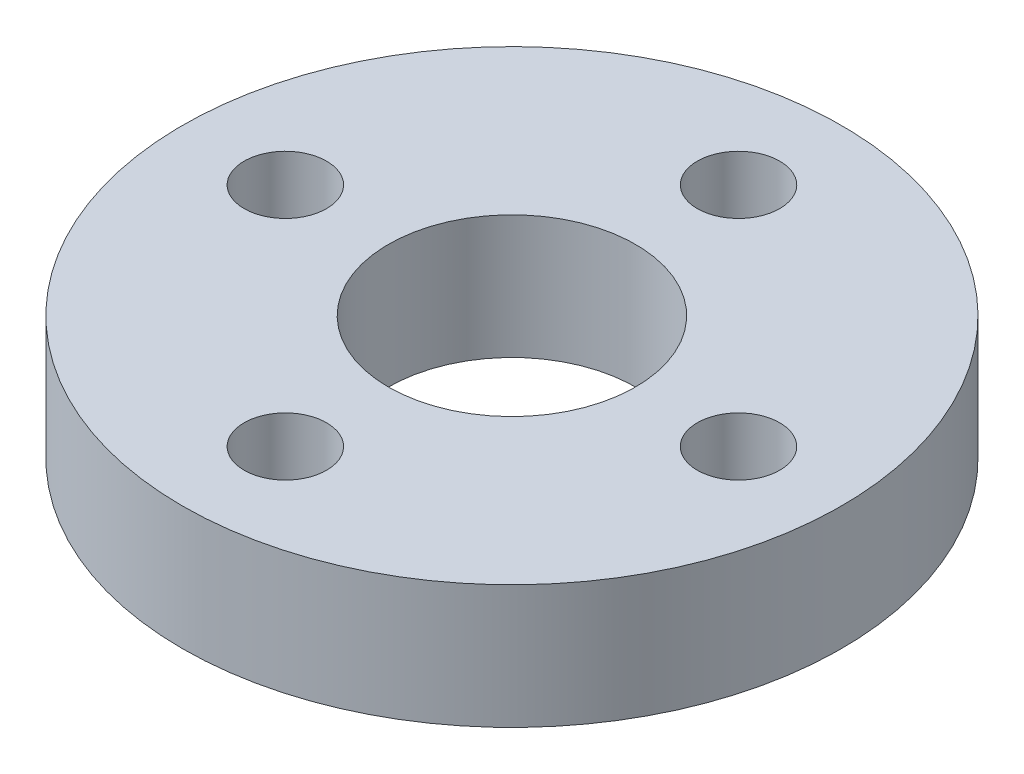
ISO-10303-21;
HEADER;
FILE_DESCRIPTION(('STEP AP214'),'2;1');
FILE_NAME('part.step','',(''),(''),'','','');
FILE_SCHEMA(('AUTOMOTIVE_DESIGN { 1 0 10303 214 1 1 1 1 }'));
ENDSEC;
DATA;
#1=APPLICATION_CONTEXT('core data for automotive mechanical design processes');
#2=APPLICATION_PROTOCOL_DEFINITION('international standard','automotive_design',2000,#1);
#3=PRODUCT_CONTEXT('',#1,'mechanical');
#4=PRODUCT('Part','Part','',(#3));
#5=PRODUCT_RELATED_PRODUCT_CATEGORY('part','',(#4));
#6=PRODUCT_DEFINITION_FORMATION('','',#4);
#7=PRODUCT_DEFINITION_CONTEXT('part definition',#1,'design');
#8=PRODUCT_DEFINITION('design','',#6,#7);
#9=PRODUCT_DEFINITION_SHAPE('','',#8);
#10=(LENGTH_UNIT() NAMED_UNIT(*) SI_UNIT(.MILLI.,.METRE.));
#11=(NAMED_UNIT(*) PLANE_ANGLE_UNIT() SI_UNIT($,.RADIAN.));
#12=(NAMED_UNIT(*) SI_UNIT($,.STERADIAN.) SOLID_ANGLE_UNIT());
#13=UNCERTAINTY_MEASURE_WITH_UNIT(LENGTH_MEASURE(1.E-05),#10,'distance_accuracy_value','');
#14=(GEOMETRIC_REPRESENTATION_CONTEXT(3) GLOBAL_UNCERTAINTY_ASSIGNED_CONTEXT((#13)) GLOBAL_UNIT_ASSIGNED_CONTEXT((#10,
#11,#12)) REPRESENTATION_CONTEXT('',''));
#15=CARTESIAN_POINT('',(0.,0.,0.));
#16=DIRECTION('',(0.,0.,1.));
#17=DIRECTION('',(1.,0.,0.));
#18=AXIS2_PLACEMENT_3D('',#15,#16,#17);
#19=CARTESIAN_POINT('',(0.,3.,0.));
#20=DIRECTION('',(0.,1.,0.));
#21=DIRECTION('',(0.,0.,1.));
#22=AXIS2_PLACEMENT_3D('',#19,#20,#21);
#23=PLANE('',#22);
#24=CARTESIAN_POINT('',(3.11291692255382E-13,3.,5.5));
#25=DIRECTION('',(0.,1.,0.));
#26=DIRECTION('',(0.,0.,1.));
#27=AXIS2_PLACEMENT_3D('',#24,#25,#26);
#28=CIRCLE('',#27,1.00000000000033);
#29=CARTESIAN_POINT('',(3.11291692255382E-13,3.,6.50000000000033));
#30=VERTEX_POINT('',#29);
#31=EDGE_CURVE('E72',#30,#30,#28,.T.);
#32=ORIENTED_EDGE('',*,*,#31,.F.);
#33=EDGE_LOOP('',(#32));
#34=FACE_BOUND('',#33,.T.);
#35=CARTESIAN_POINT('',(0.,3.,-5.5));
#36=DIRECTION('',(0.,1.,0.));
#37=DIRECTION('',(0.,0.,1.));
#38=AXIS2_PLACEMENT_3D('',#35,#36,#37);
#39=CIRCLE('',#38,1.);
#40=CARTESIAN_POINT('',(0.,3.,-4.5));
#41=VERTEX_POINT('',#40);
#42=EDGE_CURVE('E56',#41,#41,#39,.T.);
#43=ORIENTED_EDGE('',*,*,#42,.F.);
#44=EDGE_LOOP('',(#43));
#45=FACE_BOUND('',#44,.T.);
#46=CARTESIAN_POINT('',(0.,3.,0.));
#47=DIRECTION('',(0.,1.,0.));
#48=DIRECTION('',(0.,0.,1.));
#49=AXIS2_PLACEMENT_3D('',#46,#47,#48);
#50=CIRCLE('',#49,8.);
#51=CARTESIAN_POINT('',(0.,3.,8.));
#52=VERTEX_POINT('',#51);
#53=EDGE_CURVE('E10',#52,#52,#50,.T.);
#54=ORIENTED_EDGE('',*,*,#53,.T.);
#55=EDGE_LOOP('',(#54));
#56=FACE_BOUND('',#55,.T.);
#57=CARTESIAN_POINT('',(0.,3.,0.));
#58=DIRECTION('',(0.,1.,0.));
#59=DIRECTION('',(0.,0.,1.));
#60=AXIS2_PLACEMENT_3D('',#57,#58,#59);
#61=CIRCLE('',#60,3.);
#62=CARTESIAN_POINT('',(0.,3.,3.));
#63=VERTEX_POINT('',#62);
#64=EDGE_CURVE('E50',#63,#63,#61,.T.);
#65=ORIENTED_EDGE('',*,*,#64,.F.);
#66=EDGE_LOOP('',(#65));
#67=FACE_BOUND('',#66,.T.);
#68=CARTESIAN_POINT('',(5.50000000000015,3.,-1.55645846127691E-13));
#69=DIRECTION('',(0.,1.,0.));
#70=DIRECTION('',(0.,0.,1.));
#71=AXIS2_PLACEMENT_3D('',#68,#69,#70);
#72=CIRCLE('',#71,1.00000000000012);
#73=CARTESIAN_POINT('',(5.50000000000015,3.,0.999999999999966));
#74=VERTEX_POINT('',#73);
#75=EDGE_CURVE('E64',#74,#74,#72,.T.);
#76=ORIENTED_EDGE('',*,*,#75,.F.);
#77=EDGE_LOOP('',(#76));
#78=FACE_BOUND('',#77,.T.);
#79=CARTESIAN_POINT('',(-5.49999999999984,3.,1.56319401867222E-13));
#80=DIRECTION('',(0.,1.,0.));
#81=DIRECTION('',(0.,0.,1.));
#82=AXIS2_PLACEMENT_3D('',#79,#80,#81);
#83=CIRCLE('',#82,1.00000000000025);
#84=CARTESIAN_POINT('',(-5.49999999999984,3.,1.00000000000041));
#85=VERTEX_POINT('',#84);
#86=EDGE_CURVE('E80',#85,#85,#83,.T.);
#87=ORIENTED_EDGE('',*,*,#86,.F.);
#88=EDGE_LOOP('',(#87));
#89=FACE_BOUND('',#88,.T.);
#90=ADVANCED_FACE('F37',(#34,#45,#56,#67,#78,#89),#23,.T.);
#91=CARTESIAN_POINT('',(0.,0.,0.));
#92=DIRECTION('',(0.,1.,0.));
#93=DIRECTION('',(0.,0.,1.));
#94=AXIS2_PLACEMENT_3D('',#91,#92,#93);
#95=PLANE('',#94);
#96=CARTESIAN_POINT('',(0.,0.,0.));
#97=DIRECTION('',(0.,1.,0.));
#98=DIRECTION('',(0.,0.,1.));
#99=AXIS2_PLACEMENT_3D('',#96,#97,#98);
#100=CIRCLE('',#99,8.);
#101=CARTESIAN_POINT('',(0.,0.,8.));
#102=VERTEX_POINT('',#101);
#103=EDGE_CURVE('E41',#102,#102,#100,.T.);
#104=ORIENTED_EDGE('',*,*,#103,.F.);
#105=EDGE_LOOP('',(#104));
#106=FACE_BOUND('',#105,.T.);
#107=CARTESIAN_POINT('',(0.,0.,0.));
#108=DIRECTION('',(0.,1.,0.));
#109=DIRECTION('',(0.,0.,1.));
#110=AXIS2_PLACEMENT_3D('',#107,#108,#109);
#111=CIRCLE('',#110,3.);
#112=CARTESIAN_POINT('',(0.,0.,3.));
#113=VERTEX_POINT('',#112);
#114=EDGE_CURVE('E52',#113,#113,#111,.T.);
#115=ORIENTED_EDGE('',*,*,#114,.T.);
#116=EDGE_LOOP('',(#115));
#117=FACE_BOUND('',#116,.T.);
#118=CARTESIAN_POINT('',(0.,0.,-5.5));
#119=DIRECTION('',(0.,1.,0.));
#120=DIRECTION('',(0.,0.,1.));
#121=AXIS2_PLACEMENT_3D('',#118,#119,#120);
#122=CIRCLE('',#121,1.);
#123=CARTESIAN_POINT('',(0.,0.,-4.5));
#124=VERTEX_POINT('',#123);
#125=EDGE_CURVE('E60',#124,#124,#122,.T.);
#126=ORIENTED_EDGE('',*,*,#125,.T.);
#127=EDGE_LOOP('',(#126));
#128=FACE_BOUND('',#127,.T.);
#129=CARTESIAN_POINT('',(5.50000000000015,0.,-1.55645846127691E-13));
#130=DIRECTION('',(0.,1.,0.));
#131=DIRECTION('',(0.,0.,1.));
#132=AXIS2_PLACEMENT_3D('',#129,#130,#131);
#133=CIRCLE('',#132,1.00000000000012);
#134=CARTESIAN_POINT('',(5.50000000000015,0.,0.999999999999966));
#135=VERTEX_POINT('',#134);
#136=EDGE_CURVE('E68',#135,#135,#133,.T.);
#137=ORIENTED_EDGE('',*,*,#136,.T.);
#138=EDGE_LOOP('',(#137));
#139=FACE_BOUND('',#138,.T.);
#140=CARTESIAN_POINT('',(3.11291692255382E-13,0.,5.5));
#141=DIRECTION('',(0.,1.,0.));
#142=DIRECTION('',(0.,0.,1.));
#143=AXIS2_PLACEMENT_3D('',#140,#141,#142);
#144=CIRCLE('',#143,1.00000000000033);
#145=CARTESIAN_POINT('',(3.11291692255382E-13,0.,6.50000000000033));
#146=VERTEX_POINT('',#145);
#147=EDGE_CURVE('E76',#146,#146,#144,.T.);
#148=ORIENTED_EDGE('',*,*,#147,.T.);
#149=EDGE_LOOP('',(#148));
#150=FACE_BOUND('',#149,.T.);
#151=CARTESIAN_POINT('',(-5.49999999999984,0.,1.56319401867222E-13));
#152=DIRECTION('',(0.,1.,0.));
#153=DIRECTION('',(0.,0.,1.));
#154=AXIS2_PLACEMENT_3D('',#151,#152,#153);
#155=CIRCLE('',#154,1.00000000000025);
#156=CARTESIAN_POINT('',(-5.49999999999984,0.,1.00000000000041));
#157=VERTEX_POINT('',#156);
#158=EDGE_CURVE('E84',#157,#157,#155,.T.);
#159=ORIENTED_EDGE('',*,*,#158,.T.);
#160=EDGE_LOOP('',(#159));
#161=FACE_BOUND('',#160,.T.);
#162=ADVANCED_FACE('F96',(#106,#117,#128,#139,#150,#161),#95,.F.);
#163=CARTESIAN_POINT('',(0.,3.,0.));
#164=DIRECTION('',(0.,-1.,0.));
#165=DIRECTION('',(0.,0.,-1.));
#166=AXIS2_PLACEMENT_3D('',#163,#164,#165);
#167=CYLINDRICAL_SURFACE('',#166,8.);
#168=ORIENTED_EDGE('',*,*,#53,.F.);
#169=EDGE_LOOP('',(#168));
#170=FACE_BOUND('',#169,.T.);
#171=ORIENTED_EDGE('',*,*,#103,.T.);
#172=EDGE_LOOP('',(#171));
#173=FACE_BOUND('',#172,.T.);
#174=ADVANCED_FACE('F39',(#170,#173),#167,.T.);
#175=CARTESIAN_POINT('',(0.,3.,0.));
#176=DIRECTION('',(0.,-1.,0.));
#177=DIRECTION('',(0.,0.,-1.));
#178=AXIS2_PLACEMENT_3D('',#175,#176,#177);
#179=CYLINDRICAL_SURFACE('',#178,3.);
#180=ORIENTED_EDGE('',*,*,#64,.T.);
#181=EDGE_LOOP('',(#180));
#182=FACE_BOUND('',#181,.T.);
#183=ORIENTED_EDGE('',*,*,#114,.F.);
#184=EDGE_LOOP('',(#183));
#185=FACE_BOUND('',#184,.T.);
#186=ADVANCED_FACE('F106',(#182,#185),#179,.F.);
#187=CARTESIAN_POINT('',(0.,3.,-5.5));
#188=DIRECTION('',(0.,-1.,0.));
#189=DIRECTION('',(0.,0.,-1.));
#190=AXIS2_PLACEMENT_3D('',#187,#188,#189);
#191=CYLINDRICAL_SURFACE('',#190,1.);
#192=ORIENTED_EDGE('',*,*,#42,.T.);
#193=EDGE_LOOP('',(#192));
#194=FACE_BOUND('',#193,.T.);
#195=ORIENTED_EDGE('',*,*,#125,.F.);
#196=EDGE_LOOP('',(#195));
#197=FACE_BOUND('',#196,.T.);
#198=ADVANCED_FACE('F109',(#194,#197),#191,.F.);
#199=CARTESIAN_POINT('',(5.50000000000015,3.,-1.55645846127691E-13));
#200=DIRECTION('',(0.,-1.,0.));
#201=DIRECTION('',(0.,0.,-1.));
#202=AXIS2_PLACEMENT_3D('',#199,#200,#201);
#203=CYLINDRICAL_SURFACE('',#202,1.00000000000012);
#204=ORIENTED_EDGE('',*,*,#75,.T.);
#205=EDGE_LOOP('',(#204));
#206=FACE_BOUND('',#205,.T.);
#207=ORIENTED_EDGE('',*,*,#136,.F.);
#208=EDGE_LOOP('',(#207));
#209=FACE_BOUND('',#208,.T.);
#210=ADVANCED_FACE('F113',(#206,#209),#203,.F.);
#211=CARTESIAN_POINT('',(3.11291692255382E-13,3.,5.5));
#212=DIRECTION('',(0.,-1.,0.));
#213=DIRECTION('',(0.,0.,-1.));
#214=AXIS2_PLACEMENT_3D('',#211,#212,#213);
#215=CYLINDRICAL_SURFACE('',#214,1.00000000000033);
#216=ORIENTED_EDGE('',*,*,#31,.T.);
#217=EDGE_LOOP('',(#216));
#218=FACE_BOUND('',#217,.T.);
#219=ORIENTED_EDGE('',*,*,#147,.F.);
#220=EDGE_LOOP('',(#219));
#221=FACE_BOUND('',#220,.T.);
#222=ADVANCED_FACE('F117',(#218,#221),#215,.F.);
#223=CARTESIAN_POINT('',(-5.49999999999984,3.,1.56319401867222E-13));
#224=DIRECTION('',(0.,-1.,0.));
#225=DIRECTION('',(0.,0.,-1.));
#226=AXIS2_PLACEMENT_3D('',#223,#224,#225);
#227=CYLINDRICAL_SURFACE('',#226,1.00000000000025);
#228=ORIENTED_EDGE('',*,*,#86,.T.);
#229=EDGE_LOOP('',(#228));
#230=FACE_BOUND('',#229,.T.);
#231=ORIENTED_EDGE('',*,*,#158,.F.);
#232=EDGE_LOOP('',(#231));
#233=FACE_BOUND('',#232,.T.);
#234=ADVANCED_FACE('F92',(#230,#233),#227,.F.);
#235=CLOSED_SHELL('',(#90,#162,#174,#186,#198,#210,#222,#234));
#236=MANIFOLD_SOLID_BREP('B2',#235);
#237=ADVANCED_BREP_SHAPE_REPRESENTATION('',(#18,#236),#14);
#238=SHAPE_DEFINITION_REPRESENTATION(#9,#237);
ENDSEC;
END-ISO-10303-21;
